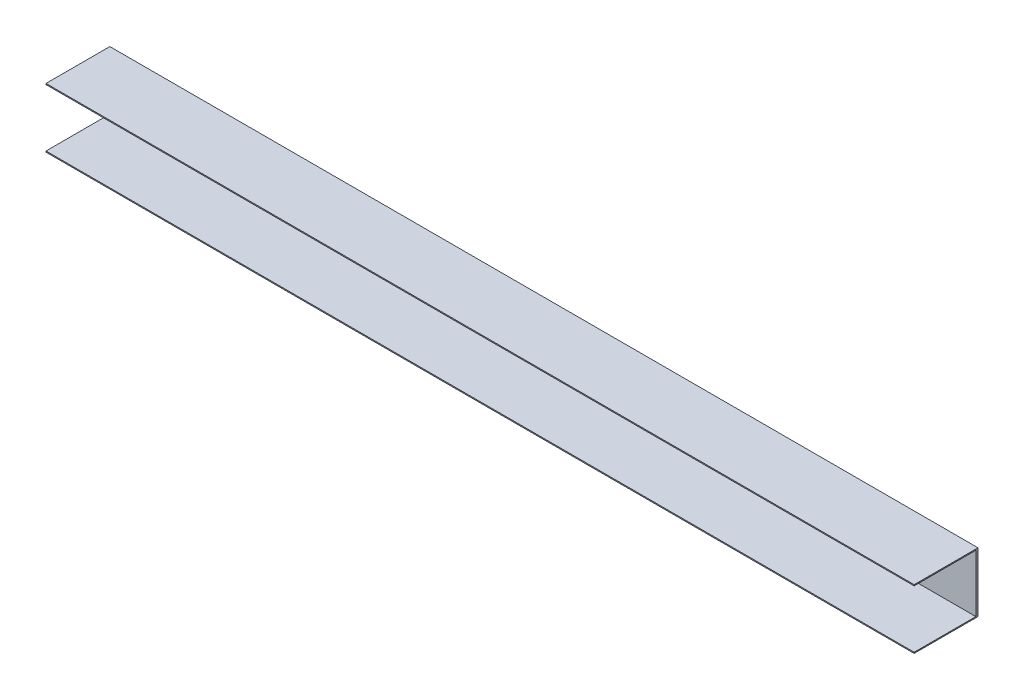
ISO-10303-21;
HEADER;
FILE_DESCRIPTION(('STEP AP214'),'2;1');
FILE_NAME('part.step','',(''),(''),'','','');
FILE_SCHEMA(('AUTOMOTIVE_DESIGN { 1 0 10303 214 1 1 1 1 }'));
ENDSEC;
DATA;
#1=APPLICATION_CONTEXT('core data for automotive mechanical design processes');
#2=APPLICATION_PROTOCOL_DEFINITION('international standard','automotive_design',2000,#1);
#3=PRODUCT_CONTEXT('',#1,'mechanical');
#4=PRODUCT('Part','Part','',(#3));
#5=PRODUCT_RELATED_PRODUCT_CATEGORY('part','',(#4));
#6=PRODUCT_DEFINITION_FORMATION('','',#4);
#7=PRODUCT_DEFINITION_CONTEXT('part definition',#1,'design');
#8=PRODUCT_DEFINITION('design','',#6,#7);
#9=PRODUCT_DEFINITION_SHAPE('','',#8);
#10=(LENGTH_UNIT() NAMED_UNIT(*) SI_UNIT(.MILLI.,.METRE.));
#11=(NAMED_UNIT(*) PLANE_ANGLE_UNIT() SI_UNIT($,.RADIAN.));
#12=(NAMED_UNIT(*) SI_UNIT($,.STERADIAN.) SOLID_ANGLE_UNIT());
#13=UNCERTAINTY_MEASURE_WITH_UNIT(LENGTH_MEASURE(1.E-05),#10,'distance_accuracy_value','');
#14=(GEOMETRIC_REPRESENTATION_CONTEXT(3) GLOBAL_UNCERTAINTY_ASSIGNED_CONTEXT((#13)) GLOBAL_UNIT_ASSIGNED_CONTEXT((#10,
#11,#12)) REPRESENTATION_CONTEXT('',''));
#15=CARTESIAN_POINT('',(0.,0.,0.));
#16=DIRECTION('',(0.,0.,1.));
#17=DIRECTION('',(1.,0.,0.));
#18=AXIS2_PLACEMENT_3D('',#15,#16,#17);
#19=CARTESIAN_POINT('',(0.,0.,30.));
#20=DIRECTION('',(0.,0.,1.));
#21=DIRECTION('',(1.,0.,0.));
#22=AXIS2_PLACEMENT_3D('',#19,#20,#21);
#23=PLANE('',#22);
#24=DIRECTION('',(-1.,0.,0.));
#25=VECTOR('',#24,1.);
#26=CARTESIAN_POINT('',(0.,13.5,30.));
#27=LINE('',#26,#25);
#28=CARTESIAN_POINT('',(204.,13.5,30.));
#29=VERTEX_POINT('',#28);
#30=CARTESIAN_POINT('',(-204.,13.5,30.));
#31=VERTEX_POINT('',#30);
#32=EDGE_CURVE('E47',#29,#31,#27,.T.);
#33=ORIENTED_EDGE('',*,*,#32,.F.);
#34=DIRECTION('',(0.,1.,0.));
#35=VECTOR('',#34,1.);
#36=CARTESIAN_POINT('',(204.,14.,30.));
#37=LINE('',#36,#35);
#38=CARTESIAN_POINT('',(204.,14.,30.));
#39=VERTEX_POINT('',#38);
#40=EDGE_CURVE('E92',#29,#39,#37,.T.);
#41=ORIENTED_EDGE('',*,*,#40,.T.);
#42=DIRECTION('',(-1.,0.,0.));
#43=VECTOR('',#42,1.);
#44=CARTESIAN_POINT('',(-204.,14.,30.));
#45=LINE('',#44,#43);
#46=CARTESIAN_POINT('',(-204.,14.,30.));
#47=VERTEX_POINT('',#46);
#48=EDGE_CURVE('E129',#39,#47,#45,.T.);
#49=ORIENTED_EDGE('',*,*,#48,.T.);
#50=DIRECTION('',(0.,-1.,0.));
#51=VECTOR('',#50,1.);
#52=CARTESIAN_POINT('',(-204.,14.,30.));
#53=LINE('',#52,#51);
#54=EDGE_CURVE('E136',#47,#31,#53,.T.);
#55=ORIENTED_EDGE('',*,*,#54,.T.);
#56=EDGE_LOOP('',(#33,#41,#49,#55));
#57=FACE_BOUND('',#56,.T.);
#58=ADVANCED_FACE('F39',(#57),#23,.T.);
#59=CARTESIAN_POINT('',(204.,14.,30.));
#60=DIRECTION('',(-1.,0.,0.));
#61=DIRECTION('',(0.,0.,1.));
#62=AXIS2_PLACEMENT_3D('',#59,#60,#61);
#63=PLANE('',#62);
#64=ORIENTED_EDGE('',*,*,#40,.F.);
#65=DIRECTION('',(0.,0.,-1.));
#66=VECTOR('',#65,1.);
#67=CARTESIAN_POINT('',(204.,13.5,30.));
#68=LINE('',#67,#66);
#69=CARTESIAN_POINT('',(204.,13.5,0.999999999999997));
#70=VERTEX_POINT('',#69);
#71=EDGE_CURVE('E161',#29,#70,#68,.T.);
#72=ORIENTED_EDGE('',*,*,#71,.T.);
#73=DIRECTION('',(0.,1.,0.));
#74=VECTOR('',#73,1.);
#75=CARTESIAN_POINT('',(204.,14.,0.999999999999997));
#76=LINE('',#75,#74);
#77=CARTESIAN_POINT('',(204.,-13.5,0.999999999999997));
#78=VERTEX_POINT('',#77);
#79=EDGE_CURVE('E125',#78,#70,#76,.T.);
#80=ORIENTED_EDGE('',*,*,#79,.F.);
#81=DIRECTION('',(0.,0.,1.));
#82=VECTOR('',#81,1.);
#83=CARTESIAN_POINT('',(204.,-13.5,30.));
#84=LINE('',#83,#82);
#85=CARTESIAN_POINT('',(204.,-13.5,30.));
#86=VERTEX_POINT('',#85);
#87=EDGE_CURVE('E115',#78,#86,#84,.T.);
#88=ORIENTED_EDGE('',*,*,#87,.T.);
#89=CARTESIAN_POINT('',(204.,-14.,30.));
#90=VERTEX_POINT('',#89);
#91=EDGE_CURVE('E123',#90,#86,#37,.T.);
#92=ORIENTED_EDGE('',*,*,#91,.F.);
#93=DIRECTION('',(0.,0.,-1.));
#94=VECTOR('',#93,1.);
#95=CARTESIAN_POINT('',(204.,-14.,30.));
#96=LINE('',#95,#94);
#97=CARTESIAN_POINT('',(204.,-14.,0.));
#98=VERTEX_POINT('',#97);
#99=EDGE_CURVE('E140',#90,#98,#96,.T.);
#100=ORIENTED_EDGE('',*,*,#99,.T.);
#101=DIRECTION('',(0.,1.,0.));
#102=VECTOR('',#101,1.);
#103=CARTESIAN_POINT('',(204.,14.,0.));
#104=LINE('',#103,#102);
#105=CARTESIAN_POINT('',(204.,14.,0.));
#106=VERTEX_POINT('',#105);
#107=EDGE_CURVE('E141',#98,#106,#104,.T.);
#108=ORIENTED_EDGE('',*,*,#107,.T.);
#109=DIRECTION('',(0.,0.,-1.));
#110=VECTOR('',#109,1.);
#111=CARTESIAN_POINT('',(204.,14.,30.));
#112=LINE('',#111,#110);
#113=EDGE_CURVE('E118',#39,#106,#112,.T.);
#114=ORIENTED_EDGE('',*,*,#113,.F.);
#115=EDGE_LOOP('',(#64,#72,#80,#88,#92,#100,#108,#114));
#116=FACE_BOUND('',#115,.T.);
#117=ADVANCED_FACE('F41',(#116),#63,.F.);
#118=CARTESIAN_POINT('',(-204.,14.,30.));
#119=DIRECTION('',(0.,-1.,0.));
#120=DIRECTION('',(0.,0.,-1.));
#121=AXIS2_PLACEMENT_3D('',#118,#119,#120);
#122=PLANE('',#121);
#123=DIRECTION('',(-1.,0.,0.));
#124=VECTOR('',#123,1.);
#125=CARTESIAN_POINT('',(-204.,14.,0.));
#126=LINE('',#125,#124);
#127=CARTESIAN_POINT('',(-204.,14.,0.));
#128=VERTEX_POINT('',#127);
#129=EDGE_CURVE('E144',#106,#128,#126,.T.);
#130=ORIENTED_EDGE('',*,*,#129,.T.);
#131=DIRECTION('',(0.,0.,-1.));
#132=VECTOR('',#131,1.);
#133=CARTESIAN_POINT('',(-204.,14.,30.));
#134=LINE('',#133,#132);
#135=EDGE_CURVE('E152',#47,#128,#134,.T.);
#136=ORIENTED_EDGE('',*,*,#135,.F.);
#137=ORIENTED_EDGE('',*,*,#48,.F.);
#138=ORIENTED_EDGE('',*,*,#113,.T.);
#139=EDGE_LOOP('',(#130,#136,#137,#138));
#140=FACE_BOUND('',#139,.T.);
#141=ADVANCED_FACE('F170',(#140),#122,.F.);
#142=CARTESIAN_POINT('',(-204.,14.,30.));
#143=DIRECTION('',(1.,0.,0.));
#144=DIRECTION('',(0.,0.,-1.));
#145=AXIS2_PLACEMENT_3D('',#142,#143,#144);
#146=PLANE('',#145);
#147=DIRECTION('',(0.,-1.,0.));
#148=VECTOR('',#147,1.);
#149=CARTESIAN_POINT('',(-204.,14.,0.999999999999997));
#150=LINE('',#149,#148);
#151=CARTESIAN_POINT('',(-204.,13.5,0.999999999999997));
#152=VERTEX_POINT('',#151);
#153=CARTESIAN_POINT('',(-204.,-13.5,0.999999999999997));
#154=VERTEX_POINT('',#153);
#155=EDGE_CURVE('E11',#152,#154,#150,.T.);
#156=ORIENTED_EDGE('',*,*,#155,.F.);
#157=DIRECTION('',(0.,0.,1.));
#158=VECTOR('',#157,1.);
#159=CARTESIAN_POINT('',(-204.,13.5,30.));
#160=LINE('',#159,#158);
#161=EDGE_CURVE('E126',#152,#31,#160,.T.);
#162=ORIENTED_EDGE('',*,*,#161,.T.);
#163=ORIENTED_EDGE('',*,*,#54,.F.);
#164=ORIENTED_EDGE('',*,*,#135,.T.);
#165=DIRECTION('',(0.,-1.,0.));
#166=VECTOR('',#165,1.);
#167=CARTESIAN_POINT('',(-204.,14.,0.));
#168=LINE('',#167,#166);
#169=CARTESIAN_POINT('',(-204.,-14.,0.));
#170=VERTEX_POINT('',#169);
#171=EDGE_CURVE('E146',#128,#170,#168,.T.);
#172=ORIENTED_EDGE('',*,*,#171,.T.);
#173=DIRECTION('',(0.,0.,-1.));
#174=VECTOR('',#173,1.);
#175=CARTESIAN_POINT('',(-204.,-14.,30.));
#176=LINE('',#175,#174);
#177=CARTESIAN_POINT('',(-204.,-14.,30.));
#178=VERTEX_POINT('',#177);
#179=EDGE_CURVE('E150',#178,#170,#176,.T.);
#180=ORIENTED_EDGE('',*,*,#179,.F.);
#181=CARTESIAN_POINT('',(-204.,-13.5,30.));
#182=VERTEX_POINT('',#181);
#183=EDGE_CURVE('E131',#182,#178,#53,.T.);
#184=ORIENTED_EDGE('',*,*,#183,.F.);
#185=DIRECTION('',(0.,0.,-1.));
#186=VECTOR('',#185,1.);
#187=CARTESIAN_POINT('',(-204.,-13.5,30.));
#188=LINE('',#187,#186);
#189=EDGE_CURVE('E54',#182,#154,#188,.T.);
#190=ORIENTED_EDGE('',*,*,#189,.T.);
#191=EDGE_LOOP('',(#156,#162,#163,#164,#172,#180,#184,#190));
#192=FACE_BOUND('',#191,.T.);
#193=ADVANCED_FACE('F165',(#192),#146,.F.);
#194=CARTESIAN_POINT('',(-204.,-14.,30.));
#195=DIRECTION('',(0.,1.,0.));
#196=DIRECTION('',(0.,0.,1.));
#197=AXIS2_PLACEMENT_3D('',#194,#195,#196);
#198=PLANE('',#197);
#199=DIRECTION('',(1.,0.,0.));
#200=VECTOR('',#199,1.);
#201=CARTESIAN_POINT('',(-204.,-14.,0.));
#202=LINE('',#201,#200);
#203=EDGE_CURVE('E84',#170,#98,#202,.T.);
#204=ORIENTED_EDGE('',*,*,#203,.T.);
#205=ORIENTED_EDGE('',*,*,#99,.F.);
#206=DIRECTION('',(1.,0.,0.));
#207=VECTOR('',#206,1.);
#208=CARTESIAN_POINT('',(-204.,-14.,30.));
#209=LINE('',#208,#207);
#210=EDGE_CURVE('E63',#178,#90,#209,.T.);
#211=ORIENTED_EDGE('',*,*,#210,.F.);
#212=ORIENTED_EDGE('',*,*,#179,.T.);
#213=EDGE_LOOP('',(#204,#205,#211,#212));
#214=FACE_BOUND('',#213,.T.);
#215=ADVANCED_FACE('F176',(#214),#198,.F.);
#216=DIRECTION('',(1.,0.,0.));
#217=VECTOR('',#216,1.);
#218=CARTESIAN_POINT('',(0.,-13.5,30.));
#219=LINE('',#218,#217);
#220=EDGE_CURVE('E112',#182,#86,#219,.T.);
#221=ORIENTED_EDGE('',*,*,#220,.F.);
#222=ORIENTED_EDGE('',*,*,#183,.T.);
#223=ORIENTED_EDGE('',*,*,#210,.T.);
#224=ORIENTED_EDGE('',*,*,#91,.T.);
#225=EDGE_LOOP('',(#221,#222,#223,#224));
#226=FACE_BOUND('',#225,.T.);
#227=ADVANCED_FACE('F128',(#226),#23,.T.);
#228=CARTESIAN_POINT('',(0.,0.,0.));
#229=DIRECTION('',(0.,0.,1.));
#230=DIRECTION('',(1.,0.,0.));
#231=AXIS2_PLACEMENT_3D('',#228,#229,#230);
#232=PLANE('',#231);
#233=ORIENTED_EDGE('',*,*,#107,.F.);
#234=ORIENTED_EDGE('',*,*,#203,.F.);
#235=ORIENTED_EDGE('',*,*,#171,.F.);
#236=ORIENTED_EDGE('',*,*,#129,.F.);
#237=EDGE_LOOP('',(#233,#234,#235,#236));
#238=FACE_BOUND('',#237,.T.);
#239=ADVANCED_FACE('F175',(#238),#232,.F.);
#240=CARTESIAN_POINT('',(0.,0.,0.999999999999997));
#241=DIRECTION('',(0.,0.,1.));
#242=DIRECTION('',(1.,0.,0.));
#243=AXIS2_PLACEMENT_3D('',#240,#241,#242);
#244=PLANE('',#243);
#245=ORIENTED_EDGE('',*,*,#79,.T.);
#246=DIRECTION('',(-1.,0.,0.));
#247=VECTOR('',#246,1.);
#248=CARTESIAN_POINT('',(213.5,13.5,0.999999999999997));
#249=LINE('',#248,#247);
#250=EDGE_CURVE('E177',#70,#152,#249,.T.);
#251=ORIENTED_EDGE('',*,*,#250,.T.);
#252=ORIENTED_EDGE('',*,*,#155,.T.);
#253=DIRECTION('',(1.,0.,0.));
#254=VECTOR('',#253,1.);
#255=CARTESIAN_POINT('',(213.5,-13.5,0.999999999999997));
#256=LINE('',#255,#254);
#257=EDGE_CURVE('E179',#154,#78,#256,.T.);
#258=ORIENTED_EDGE('',*,*,#257,.T.);
#259=EDGE_LOOP('',(#245,#251,#252,#258));
#260=FACE_BOUND('',#259,.T.);
#261=ADVANCED_FACE('F183',(#260),#244,.T.);
#262=CARTESIAN_POINT('',(213.5,13.5,0.999999999999997));
#263=DIRECTION('',(0.,1.,0.));
#264=DIRECTION('',(-1.,0.,0.));
#265=AXIS2_PLACEMENT_3D('',#262,#263,#264);
#266=PLANE('',#265);
#267=ORIENTED_EDGE('',*,*,#32,.T.);
#268=ORIENTED_EDGE('',*,*,#161,.F.);
#269=ORIENTED_EDGE('',*,*,#250,.F.);
#270=ORIENTED_EDGE('',*,*,#71,.F.);
#271=EDGE_LOOP('',(#267,#268,#269,#270));
#272=FACE_BOUND('',#271,.T.);
#273=ADVANCED_FACE('F158',(#272),#266,.F.);
#274=CARTESIAN_POINT('',(213.5,-13.5,0.999999999999997));
#275=DIRECTION('',(0.,-1.,0.));
#276=DIRECTION('',(1.,0.,0.));
#277=AXIS2_PLACEMENT_3D('',#274,#275,#276);
#278=PLANE('',#277);
#279=ORIENTED_EDGE('',*,*,#257,.F.);
#280=ORIENTED_EDGE('',*,*,#189,.F.);
#281=ORIENTED_EDGE('',*,*,#220,.T.);
#282=ORIENTED_EDGE('',*,*,#87,.F.);
#283=EDGE_LOOP('',(#279,#280,#281,#282));
#284=FACE_BOUND('',#283,.T.);
#285=ADVANCED_FACE('F114',(#284),#278,.F.);
#286=CLOSED_SHELL('',(#58,#117,#141,#193,#215,#227,#239,#261,#273,#285));
#287=MANIFOLD_SOLID_BREP('B2',#286);
#288=ADVANCED_BREP_SHAPE_REPRESENTATION('',(#18,#287),#14);
#289=SHAPE_DEFINITION_REPRESENTATION(#9,#288);
ENDSEC;
END-ISO-10303-21;
